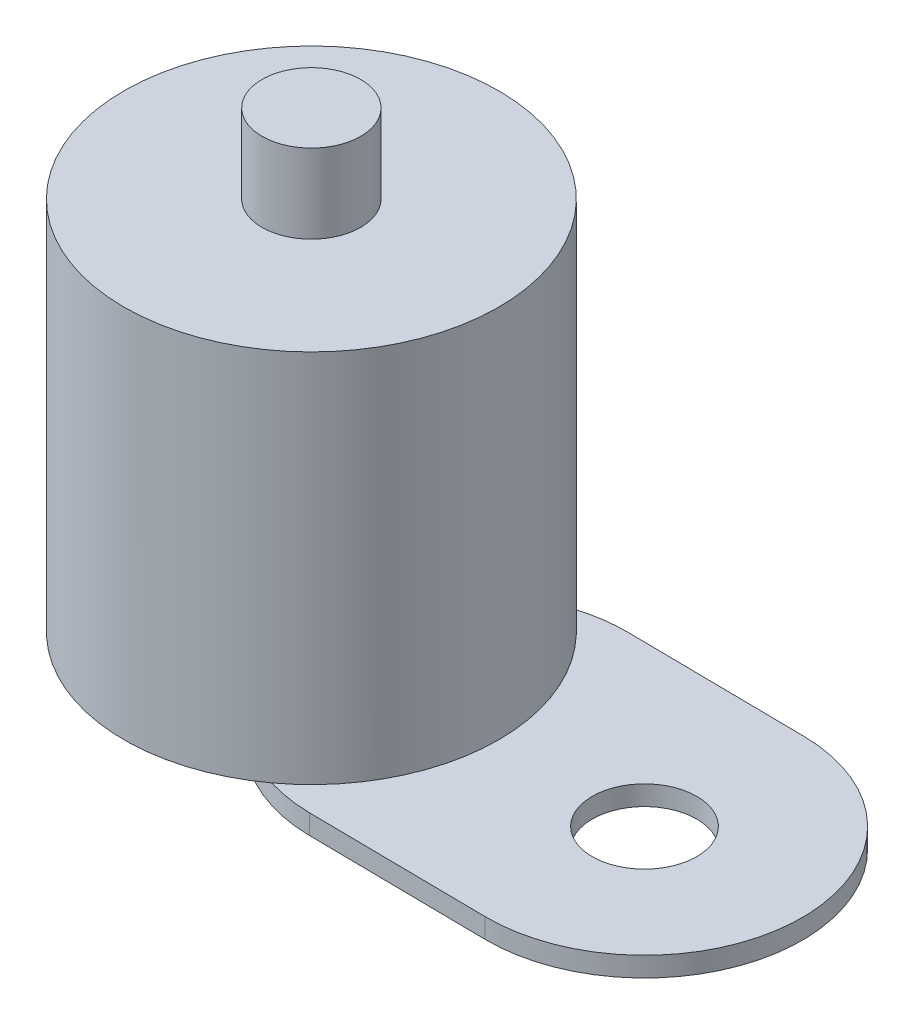
ISO-10303-21;
HEADER;
FILE_DESCRIPTION(('STEP AP214'),'2;1');
FILE_NAME('part.step','',(''),(''),'','','');
FILE_SCHEMA(('AUTOMOTIVE_DESIGN { 1 0 10303 214 1 1 1 1 }'));
ENDSEC;
DATA;
#1=APPLICATION_CONTEXT('core data for automotive mechanical design processes');
#2=APPLICATION_PROTOCOL_DEFINITION('international standard','automotive_design',2000,#1);
#3=PRODUCT_CONTEXT('',#1,'mechanical');
#4=PRODUCT('Part','Part','',(#3));
#5=PRODUCT_RELATED_PRODUCT_CATEGORY('part','',(#4));
#6=PRODUCT_DEFINITION_FORMATION('','',#4);
#7=PRODUCT_DEFINITION_CONTEXT('part definition',#1,'design');
#8=PRODUCT_DEFINITION('design','',#6,#7);
#9=PRODUCT_DEFINITION_SHAPE('','',#8);
#10=(LENGTH_UNIT() NAMED_UNIT(*) SI_UNIT(.MILLI.,.METRE.));
#11=(NAMED_UNIT(*) PLANE_ANGLE_UNIT() SI_UNIT($,.RADIAN.));
#12=(NAMED_UNIT(*) SI_UNIT($,.STERADIAN.) SOLID_ANGLE_UNIT());
#13=UNCERTAINTY_MEASURE_WITH_UNIT(LENGTH_MEASURE(1.E-05),#10,'distance_accuracy_value','');
#14=(GEOMETRIC_REPRESENTATION_CONTEXT(3) GLOBAL_UNCERTAINTY_ASSIGNED_CONTEXT((#13)) GLOBAL_UNIT_ASSIGNED_CONTEXT((#10,
#11,#12)) REPRESENTATION_CONTEXT('',''));
#15=CARTESIAN_POINT('',(0.,0.,0.));
#16=DIRECTION('',(0.,0.,1.));
#17=DIRECTION('',(1.,0.,0.));
#18=AXIS2_PLACEMENT_3D('',#15,#16,#17);
#19=CARTESIAN_POINT('',(0.,19.,0.));
#20=DIRECTION('',(0.,-1.,0.));
#21=DIRECTION('',(0.,0.,-1.));
#22=AXIS2_PLACEMENT_3D('',#19,#20,#21);
#23=CYLINDRICAL_SURFACE('',#22,9.5);
#24=CARTESIAN_POINT('',(0.,19.,0.));
#25=DIRECTION('',(0.,1.,0.));
#26=DIRECTION('',(0.,0.,1.));
#27=AXIS2_PLACEMENT_3D('',#24,#25,#26);
#28=CIRCLE('',#27,9.5);
#29=CARTESIAN_POINT('',(0.,19.,9.5));
#30=VERTEX_POINT('',#29);
#31=EDGE_CURVE('E135',#30,#30,#28,.T.);
#32=ORIENTED_EDGE('',*,*,#31,.F.);
#33=EDGE_LOOP('',(#32));
#34=FACE_BOUND('',#33,.T.);
#35=CARTESIAN_POINT('',(0.,0.,0.));
#36=DIRECTION('',(0.,1.,0.));
#37=DIRECTION('',(0.,0.,1.));
#38=AXIS2_PLACEMENT_3D('',#35,#36,#37);
#39=CIRCLE('',#38,9.5);
#40=CARTESIAN_POINT('',(5.640625,0.,7.64417095631534));
#41=VERTEX_POINT('',#40);
#42=CARTESIAN_POINT('',(5.640625,0.,-7.64417095631534));
#43=VERTEX_POINT('',#42);
#44=EDGE_CURVE('E48',#41,#43,#39,.T.);
#45=ORIENTED_EDGE('',*,*,#44,.T.);
#46=EDGE_CURVE('E127',#43,#41,#39,.T.);
#47=ORIENTED_EDGE('',*,*,#46,.T.);
#48=EDGE_LOOP('',(#45,#47));
#49=FACE_BOUND('',#48,.T.);
#50=ADVANCED_FACE('F45',(#34,#49),#23,.T.);
#51=CARTESIAN_POINT('',(0.,19.,0.));
#52=DIRECTION('',(0.,1.,0.));
#53=DIRECTION('',(0.,0.,1.));
#54=AXIS2_PLACEMENT_3D('',#51,#52,#53);
#55=PLANE('',#54);
#56=CARTESIAN_POINT('',(0.,19.,0.));
#57=DIRECTION('',(0.,1.,0.));
#58=DIRECTION('',(0.,0.,1.));
#59=AXIS2_PLACEMENT_3D('',#56,#57,#58);
#60=CIRCLE('',#59,2.5);
#61=CARTESIAN_POINT('',(0.,19.,2.5));
#62=VERTEX_POINT('',#61);
#63=EDGE_CURVE('E54',#62,#62,#60,.T.);
#64=ORIENTED_EDGE('',*,*,#63,.F.);
#65=EDGE_LOOP('',(#64));
#66=FACE_BOUND('',#65,.T.);
#67=ORIENTED_EDGE('',*,*,#31,.T.);
#68=EDGE_LOOP('',(#67));
#69=FACE_BOUND('',#68,.T.);
#70=ADVANCED_FACE('F197',(#66,#69),#55,.T.);
#71=CARTESIAN_POINT('',(0.,0.,0.));
#72=DIRECTION('',(0.,1.,0.));
#73=DIRECTION('',(0.,0.,1.));
#74=AXIS2_PLACEMENT_3D('',#71,#72,#73);
#75=PLANE('',#74);
#76=CARTESIAN_POINT('',(8.,0.,0.));
#77=DIRECTION('',(0.,-1.,0.));
#78=DIRECTION('',(0.,0.,-1.));
#79=AXIS2_PLACEMENT_3D('',#76,#77,#78);
#80=CIRCLE('',#79,8.);
#81=EDGE_CURVE('E11',#41,#43,#80,.T.);
#82=ORIENTED_EDGE('',*,*,#81,.F.);
#83=ORIENTED_EDGE('',*,*,#46,.F.);
#84=EDGE_LOOP('',(#82,#83));
#85=FACE_BOUND('',#84,.T.);
#86=ADVANCED_FACE('F202',(#85),#75,.F.);
#87=CARTESIAN_POINT('',(0.,23.,0.));
#88=DIRECTION('',(0.,-1.,0.));
#89=DIRECTION('',(0.,0.,-1.));
#90=AXIS2_PLACEMENT_3D('',#87,#88,#89);
#91=CYLINDRICAL_SURFACE('',#90,2.5);
#92=CARTESIAN_POINT('',(0.,23.,0.));
#93=DIRECTION('',(0.,1.,0.));
#94=DIRECTION('',(0.,0.,1.));
#95=AXIS2_PLACEMENT_3D('',#92,#93,#94);
#96=CIRCLE('',#95,2.5);
#97=CARTESIAN_POINT('',(0.,23.,2.5));
#98=VERTEX_POINT('',#97);
#99=EDGE_CURVE('E122',#98,#98,#96,.T.);
#100=ORIENTED_EDGE('',*,*,#99,.F.);
#101=EDGE_LOOP('',(#100));
#102=FACE_BOUND('',#101,.T.);
#103=ORIENTED_EDGE('',*,*,#63,.T.);
#104=EDGE_LOOP('',(#103));
#105=FACE_BOUND('',#104,.T.);
#106=ADVANCED_FACE('F192',(#102,#105),#91,.T.);
#107=CARTESIAN_POINT('',(0.,23.,0.));
#108=DIRECTION('',(0.,1.,0.));
#109=DIRECTION('',(0.,0.,1.));
#110=AXIS2_PLACEMENT_3D('',#107,#108,#109);
#111=PLANE('',#110);
#112=ORIENTED_EDGE('',*,*,#99,.T.);
#113=EDGE_LOOP('',(#112));
#114=FACE_BOUND('',#113,.T.);
#115=ADVANCED_FACE('F185',(#114),#111,.T.);
#116=CARTESIAN_POINT('',(8.,-1.,0.));
#117=DIRECTION('',(0.,-1.,0.));
#118=DIRECTION('',(0.,0.,-1.));
#119=AXIS2_PLACEMENT_3D('',#116,#117,#118);
#120=PLANE('',#119);
#121=CARTESIAN_POINT('',(8.,-1.,0.));
#122=DIRECTION('',(0.,-1.,0.));
#123=DIRECTION('',(0.,0.,-1.));
#124=AXIS2_PLACEMENT_3D('',#121,#122,#123);
#125=CIRCLE('',#124,8.);
#126=CARTESIAN_POINT('',(7.90303742582277,-1.,7.99941236961872));
#127=VERTEX_POINT('',#126);
#128=CARTESIAN_POINT('',(8.09696257417723,-1.,-7.99941236961872));
#129=VERTEX_POINT('',#128);
#130=EDGE_CURVE('E104',#127,#129,#125,.T.);
#131=ORIENTED_EDGE('',*,*,#130,.T.);
#132=DIRECTION('',(0.999926546202339,0.,0.0121203217721533));
#133=VECTOR('',#132,1.);
#134=CARTESIAN_POINT('',(8.09696257417723,-1.,-7.99941236961872));
#135=LINE('',#134,#133);
#136=CARTESIAN_POINT('',(17.0969625741772,-1.,-7.89032146052777));
#137=VERTEX_POINT('',#136);
#138=EDGE_CURVE('E93',#129,#137,#135,.T.);
#139=ORIENTED_EDGE('',*,*,#138,.T.);
#140=CARTESIAN_POINT('',(17.,-1.,0.10909090909095));
#141=DIRECTION('',(0.,-1.,0.));
#142=DIRECTION('',(0.,0.,-1.));
#143=AXIS2_PLACEMENT_3D('',#140,#141,#142);
#144=CIRCLE('',#143,8.00000000000001);
#145=CARTESIAN_POINT('',(16.9030374258228,-1.,8.10850327870967));
#146=VERTEX_POINT('',#145);
#147=EDGE_CURVE('E103',#137,#146,#144,.T.);
#148=ORIENTED_EDGE('',*,*,#147,.T.);
#149=DIRECTION('',(-0.999926546202339,0.,-0.0121203217721544));
#150=VECTOR('',#149,1.);
#151=CARTESIAN_POINT('',(7.90303742582277,-1.,7.99941236961872));
#152=LINE('',#151,#150);
#153=EDGE_CURVE('E110',#146,#127,#152,.T.);
#154=ORIENTED_EDGE('',*,*,#153,.T.);
#155=EDGE_LOOP('',(#131,#139,#148,#154));
#156=FACE_BOUND('',#155,.T.);
#157=CARTESIAN_POINT('',(17.,-1.,0.10909090909095));
#158=DIRECTION('',(0.,-1.,0.));
#159=DIRECTION('',(0.,0.,-1.));
#160=AXIS2_PLACEMENT_3D('',#157,#158,#159);
#161=CIRCLE('',#160,2.65);
#162=CARTESIAN_POINT('',(17.,-1.,-2.54090909090905));
#163=VERTEX_POINT('',#162);
#164=EDGE_CURVE('E154',#163,#163,#161,.T.);
#165=ORIENTED_EDGE('',*,*,#164,.F.);
#166=EDGE_LOOP('',(#165));
#167=FACE_BOUND('',#166,.T.);
#168=ADVANCED_FACE('F107',(#156,#167),#120,.T.);
#169=CARTESIAN_POINT('',(8.,0.,0.));
#170=DIRECTION('',(0.,-1.,0.));
#171=DIRECTION('',(0.,0.,-1.));
#172=AXIS2_PLACEMENT_3D('',#169,#170,#171);
#173=PLANE('',#172);
#174=ORIENTED_EDGE('',*,*,#44,.F.);
#175=CARTESIAN_POINT('',(7.90303742582277,0.,7.99941236961872));
#176=VERTEX_POINT('',#175);
#177=EDGE_CURVE('E56',#176,#41,#80,.T.);
#178=ORIENTED_EDGE('',*,*,#177,.F.);
#179=DIRECTION('',(-0.999926546202339,0.,-0.0121203217721544));
#180=VECTOR('',#179,1.);
#181=CARTESIAN_POINT('',(7.90303742582277,0.,7.99941236961872));
#182=LINE('',#181,#180);
#183=CARTESIAN_POINT('',(16.9030374258228,0.,8.10850327870967));
#184=VERTEX_POINT('',#183);
#185=EDGE_CURVE('E115',#184,#176,#182,.T.);
#186=ORIENTED_EDGE('',*,*,#185,.F.);
#187=CARTESIAN_POINT('',(17.,0.,0.10909090909095));
#188=DIRECTION('',(0.,-1.,0.));
#189=DIRECTION('',(0.,0.,-1.));
#190=AXIS2_PLACEMENT_3D('',#187,#188,#189);
#191=CIRCLE('',#190,8.00000000000001);
#192=CARTESIAN_POINT('',(17.0969625741772,0.,-7.89032146052777));
#193=VERTEX_POINT('',#192);
#194=EDGE_CURVE('E152',#193,#184,#191,.T.);
#195=ORIENTED_EDGE('',*,*,#194,.F.);
#196=DIRECTION('',(0.999926546202339,0.,0.0121203217721533));
#197=VECTOR('',#196,1.);
#198=CARTESIAN_POINT('',(8.09696257417723,0.,-7.99941236961872));
#199=LINE('',#198,#197);
#200=CARTESIAN_POINT('',(8.09696257417723,0.,-7.99941236961872));
#201=VERTEX_POINT('',#200);
#202=EDGE_CURVE('E149',#201,#193,#199,.T.);
#203=ORIENTED_EDGE('',*,*,#202,.F.);
#204=EDGE_CURVE('E57',#43,#201,#80,.T.);
#205=ORIENTED_EDGE('',*,*,#204,.F.);
#206=EDGE_LOOP('',(#174,#178,#186,#195,#203,#205));
#207=FACE_BOUND('',#206,.T.);
#208=CARTESIAN_POINT('',(17.,0.,0.10909090909095));
#209=DIRECTION('',(0.,-1.,0.));
#210=DIRECTION('',(0.,0.,-1.));
#211=AXIS2_PLACEMENT_3D('',#208,#209,#210);
#212=CIRCLE('',#211,2.65);
#213=CARTESIAN_POINT('',(17.,0.,-2.54090909090905));
#214=VERTEX_POINT('',#213);
#215=EDGE_CURVE('E174',#214,#214,#212,.T.);
#216=ORIENTED_EDGE('',*,*,#215,.T.);
#217=EDGE_LOOP('',(#216));
#218=FACE_BOUND('',#217,.T.);
#219=ADVANCED_FACE('F144',(#207,#218),#173,.F.);
#220=CARTESIAN_POINT('',(8.,-1.,0.));
#221=DIRECTION('',(0.,1.,0.));
#222=DIRECTION('',(0.,0.,1.));
#223=AXIS2_PLACEMENT_3D('',#220,#221,#222);
#224=CYLINDRICAL_SURFACE('',#223,8.);
#225=ORIENTED_EDGE('',*,*,#177,.T.);
#226=ORIENTED_EDGE('',*,*,#81,.T.);
#227=ORIENTED_EDGE('',*,*,#204,.T.);
#228=DIRECTION('',(0.,1.,0.));
#229=VECTOR('',#228,1.);
#230=CARTESIAN_POINT('',(8.09696257417723,-1.,-7.99941236961872));
#231=LINE('',#230,#229);
#232=EDGE_CURVE('E97',#129,#201,#231,.T.);
#233=ORIENTED_EDGE('',*,*,#232,.F.);
#234=ORIENTED_EDGE('',*,*,#130,.F.);
#235=DIRECTION('',(0.,1.,0.));
#236=VECTOR('',#235,1.);
#237=CARTESIAN_POINT('',(7.90303742582277,-1.,7.99941236961872));
#238=LINE('',#237,#236);
#239=EDGE_CURVE('E147',#127,#176,#238,.T.);
#240=ORIENTED_EDGE('',*,*,#239,.T.);
#241=EDGE_LOOP('',(#225,#226,#227,#233,#234,#240));
#242=FACE_BOUND('',#241,.T.);
#243=ADVANCED_FACE('F118',(#242),#224,.T.);
#244=CARTESIAN_POINT('',(8.09696257417723,-1.,-7.99941236961872));
#245=DIRECTION('',(-0.0121203217721533,0.,0.99992654620234));
#246=DIRECTION('',(0.99992654620234,0.,0.0121203217721533));
#247=AXIS2_PLACEMENT_3D('',#244,#245,#246);
#248=PLANE('',#247);
#249=ORIENTED_EDGE('',*,*,#202,.T.);
#250=DIRECTION('',(0.,1.,0.));
#251=VECTOR('',#250,1.);
#252=CARTESIAN_POINT('',(17.0969625741772,-1.,-7.89032146052777));
#253=LINE('',#252,#251);
#254=EDGE_CURVE('E99',#137,#193,#253,.T.);
#255=ORIENTED_EDGE('',*,*,#254,.F.);
#256=ORIENTED_EDGE('',*,*,#138,.F.);
#257=ORIENTED_EDGE('',*,*,#232,.T.);
#258=EDGE_LOOP('',(#249,#255,#256,#257));
#259=FACE_BOUND('',#258,.T.);
#260=ADVANCED_FACE('F95',(#259),#248,.F.);
#261=CARTESIAN_POINT('',(17.,-1.,0.10909090909095));
#262=DIRECTION('',(0.,1.,0.));
#263=DIRECTION('',(0.,0.,1.));
#264=AXIS2_PLACEMENT_3D('',#261,#262,#263);
#265=CYLINDRICAL_SURFACE('',#264,8.00000000000001);
#266=ORIENTED_EDGE('',*,*,#194,.T.);
#267=DIRECTION('',(0.,1.,0.));
#268=VECTOR('',#267,1.);
#269=CARTESIAN_POINT('',(16.9030374258228,-1.,8.10850327870967));
#270=LINE('',#269,#268);
#271=EDGE_CURVE('E129',#146,#184,#270,.T.);
#272=ORIENTED_EDGE('',*,*,#271,.F.);
#273=ORIENTED_EDGE('',*,*,#147,.F.);
#274=ORIENTED_EDGE('',*,*,#254,.T.);
#275=EDGE_LOOP('',(#266,#272,#273,#274));
#276=FACE_BOUND('',#275,.T.);
#277=ADVANCED_FACE('F170',(#276),#265,.T.);
#278=CARTESIAN_POINT('',(7.90303742582277,-1.,7.99941236961872));
#279=DIRECTION('',(0.0121203217721544,0.,-0.99992654620234));
#280=DIRECTION('',(-0.99992654620234,0.,-0.0121203217721544));
#281=AXIS2_PLACEMENT_3D('',#278,#279,#280);
#282=PLANE('',#281);
#283=ORIENTED_EDGE('',*,*,#185,.T.);
#284=ORIENTED_EDGE('',*,*,#239,.F.);
#285=ORIENTED_EDGE('',*,*,#153,.F.);
#286=ORIENTED_EDGE('',*,*,#271,.T.);
#287=EDGE_LOOP('',(#283,#284,#285,#286));
#288=FACE_BOUND('',#287,.T.);
#289=ADVANCED_FACE('F167',(#288),#282,.F.);
#290=CARTESIAN_POINT('',(17.,-1.,0.10909090909095));
#291=DIRECTION('',(0.,1.,0.));
#292=DIRECTION('',(0.,0.,1.));
#293=AXIS2_PLACEMENT_3D('',#290,#291,#292);
#294=CYLINDRICAL_SURFACE('',#293,2.65);
#295=ORIENTED_EDGE('',*,*,#164,.T.);
#296=EDGE_LOOP('',(#295));
#297=FACE_BOUND('',#296,.T.);
#298=ORIENTED_EDGE('',*,*,#215,.F.);
#299=EDGE_LOOP('',(#298));
#300=FACE_BOUND('',#299,.T.);
#301=ADVANCED_FACE('F182',(#297,#300),#294,.F.);
#302=CLOSED_SHELL('',(#50,#70,#86,#106,#115,#168,#219,#243,#260,#277,#289,#301));
#303=MANIFOLD_SOLID_BREP('B2',#302);
#304=ADVANCED_BREP_SHAPE_REPRESENTATION('',(#18,#303),#14);
#305=SHAPE_DEFINITION_REPRESENTATION(#9,#304);
ENDSEC;
END-ISO-10303-21;
